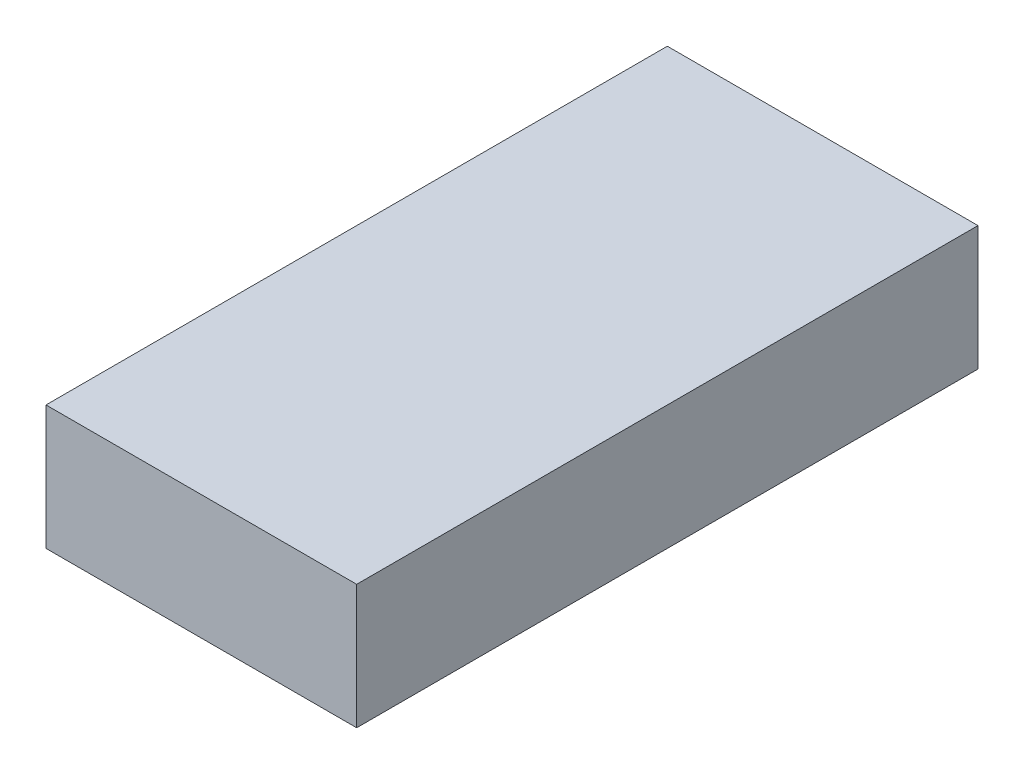
ISO-10303-21;
HEADER;
FILE_DESCRIPTION(('STEP AP214'),'2;1');
FILE_NAME('part.step','',(''),(''),'','','');
FILE_SCHEMA(('AUTOMOTIVE_DESIGN { 1 0 10303 214 1 1 1 1 }'));
ENDSEC;
DATA;
#1=APPLICATION_CONTEXT('core data for automotive mechanical design processes');
#2=APPLICATION_PROTOCOL_DEFINITION('international standard','automotive_design',2000,#1);
#3=PRODUCT_CONTEXT('',#1,'mechanical');
#4=PRODUCT('Part','Part','',(#3));
#5=PRODUCT_RELATED_PRODUCT_CATEGORY('part','',(#4));
#6=PRODUCT_DEFINITION_FORMATION('','',#4);
#7=PRODUCT_DEFINITION_CONTEXT('part definition',#1,'design');
#8=PRODUCT_DEFINITION('design','',#6,#7);
#9=PRODUCT_DEFINITION_SHAPE('','',#8);
#10=(LENGTH_UNIT() NAMED_UNIT(*) SI_UNIT(.MILLI.,.METRE.));
#11=(NAMED_UNIT(*) PLANE_ANGLE_UNIT() SI_UNIT($,.RADIAN.));
#12=(NAMED_UNIT(*) SI_UNIT($,.STERADIAN.) SOLID_ANGLE_UNIT());
#13=UNCERTAINTY_MEASURE_WITH_UNIT(LENGTH_MEASURE(1.E-05),#10,'distance_accuracy_value','');
#14=(GEOMETRIC_REPRESENTATION_CONTEXT(3) GLOBAL_UNCERTAINTY_ASSIGNED_CONTEXT((#13)) GLOBAL_UNIT_ASSIGNED_CONTEXT((#10,
#11,#12)) REPRESENTATION_CONTEXT('',''));
#15=CARTESIAN_POINT('',(0.,0.,0.));
#16=DIRECTION('',(0.,0.,1.));
#17=DIRECTION('',(1.,0.,0.));
#18=AXIS2_PLACEMENT_3D('',#15,#16,#17);
#19=CARTESIAN_POINT('',(0.,0.,100.));
#20=DIRECTION('',(-1.,0.,0.));
#21=DIRECTION('',(0.,0.,1.));
#22=AXIS2_PLACEMENT_3D('',#19,#20,#21);
#23=PLANE('',#22);
#24=DIRECTION('',(0.,1.,0.));
#25=VECTOR('',#24,1.);
#26=CARTESIAN_POINT('',(0.,0.,0.));
#27=LINE('',#26,#25);
#28=CARTESIAN_POINT('',(0.,0.,0.));
#29=VERTEX_POINT('',#28);
#30=CARTESIAN_POINT('',(0.,20.,0.));
#31=VERTEX_POINT('',#30);
#32=EDGE_CURVE('E96',#29,#31,#27,.T.);
#33=ORIENTED_EDGE('',*,*,#32,.T.);
#34=DIRECTION('',(0.,0.,-1.));
#35=VECTOR('',#34,1.);
#36=CARTESIAN_POINT('',(0.,20.,100.));
#37=LINE('',#36,#35);
#38=CARTESIAN_POINT('',(0.,20.,100.));
#39=VERTEX_POINT('',#38);
#40=EDGE_CURVE('E11',#39,#31,#37,.T.);
#41=ORIENTED_EDGE('',*,*,#40,.F.);
#42=DIRECTION('',(0.,1.,0.));
#43=VECTOR('',#42,1.);
#44=CARTESIAN_POINT('',(0.,0.,100.));
#45=LINE('',#44,#43);
#46=CARTESIAN_POINT('',(0.,0.,100.));
#47=VERTEX_POINT('',#46);
#48=EDGE_CURVE('E84',#47,#39,#45,.T.);
#49=ORIENTED_EDGE('',*,*,#48,.F.);
#50=DIRECTION('',(0.,0.,-1.));
#51=VECTOR('',#50,1.);
#52=CARTESIAN_POINT('',(0.,0.,100.));
#53=LINE('',#52,#51);
#54=EDGE_CURVE('E92',#47,#29,#53,.T.);
#55=ORIENTED_EDGE('',*,*,#54,.T.);
#56=EDGE_LOOP('',(#33,#41,#49,#55));
#57=FACE_BOUND('',#56,.T.);
#58=ADVANCED_FACE('F33',(#57),#23,.F.);
#59=CARTESIAN_POINT('',(0.,20.,100.));
#60=DIRECTION('',(0.,-1.,0.));
#61=DIRECTION('',(1.,0.,0.));
#62=AXIS2_PLACEMENT_3D('',#59,#60,#61);
#63=PLANE('',#62);
#64=DIRECTION('',(-1.,0.,0.));
#65=VECTOR('',#64,1.);
#66=CARTESIAN_POINT('',(0.,20.,0.));
#67=LINE('',#66,#65);
#68=CARTESIAN_POINT('',(-50.,20.,0.));
#69=VERTEX_POINT('',#68);
#70=EDGE_CURVE('E88',#31,#69,#67,.T.);
#71=ORIENTED_EDGE('',*,*,#70,.T.);
#72=DIRECTION('',(0.,0.,-1.));
#73=VECTOR('',#72,1.);
#74=CARTESIAN_POINT('',(-50.,20.,100.));
#75=LINE('',#74,#73);
#76=CARTESIAN_POINT('',(-50.,20.,100.));
#77=VERTEX_POINT('',#76);
#78=EDGE_CURVE('E41',#77,#69,#75,.T.);
#79=ORIENTED_EDGE('',*,*,#78,.F.);
#80=DIRECTION('',(-1.,0.,0.));
#81=VECTOR('',#80,1.);
#82=CARTESIAN_POINT('',(0.,20.,100.));
#83=LINE('',#82,#81);
#84=EDGE_CURVE('E79',#39,#77,#83,.T.);
#85=ORIENTED_EDGE('',*,*,#84,.F.);
#86=ORIENTED_EDGE('',*,*,#40,.T.);
#87=EDGE_LOOP('',(#71,#79,#85,#86));
#88=FACE_BOUND('',#87,.T.);
#89=ADVANCED_FACE('F87',(#88),#63,.F.);
#90=CARTESIAN_POINT('',(-50.,0.,100.));
#91=DIRECTION('',(1.,0.,0.));
#92=DIRECTION('',(0.,0.,-1.));
#93=AXIS2_PLACEMENT_3D('',#90,#91,#92);
#94=PLANE('',#93);
#95=DIRECTION('',(0.,-1.,0.));
#96=VECTOR('',#95,1.);
#97=CARTESIAN_POINT('',(-50.,0.,0.));
#98=LINE('',#97,#96);
#99=CARTESIAN_POINT('',(-50.,0.,0.));
#100=VERTEX_POINT('',#99);
#101=EDGE_CURVE('E66',#69,#100,#98,.T.);
#102=ORIENTED_EDGE('',*,*,#101,.T.);
#103=DIRECTION('',(0.,0.,-1.));
#104=VECTOR('',#103,1.);
#105=CARTESIAN_POINT('',(-50.,0.,100.));
#106=LINE('',#105,#104);
#107=CARTESIAN_POINT('',(-50.,0.,100.));
#108=VERTEX_POINT('',#107);
#109=EDGE_CURVE('E89',#108,#100,#106,.T.);
#110=ORIENTED_EDGE('',*,*,#109,.F.);
#111=DIRECTION('',(0.,-1.,0.));
#112=VECTOR('',#111,1.);
#113=CARTESIAN_POINT('',(-50.,0.,100.));
#114=LINE('',#113,#112);
#115=EDGE_CURVE('E82',#77,#108,#114,.T.);
#116=ORIENTED_EDGE('',*,*,#115,.F.);
#117=ORIENTED_EDGE('',*,*,#78,.T.);
#118=EDGE_LOOP('',(#102,#110,#116,#117));
#119=FACE_BOUND('',#118,.T.);
#120=ADVANCED_FACE('F90',(#119),#94,.F.);
#121=CARTESIAN_POINT('',(0.,0.,100.));
#122=DIRECTION('',(0.,1.,0.));
#123=DIRECTION('',(0.,0.,1.));
#124=AXIS2_PLACEMENT_3D('',#121,#122,#123);
#125=PLANE('',#124);
#126=DIRECTION('',(1.,0.,0.));
#127=VECTOR('',#126,1.);
#128=CARTESIAN_POINT('',(0.,0.,0.));
#129=LINE('',#128,#127);
#130=EDGE_CURVE('E72',#100,#29,#129,.T.);
#131=ORIENTED_EDGE('',*,*,#130,.T.);
#132=ORIENTED_EDGE('',*,*,#54,.F.);
#133=DIRECTION('',(1.,0.,0.));
#134=VECTOR('',#133,1.);
#135=CARTESIAN_POINT('',(0.,0.,100.));
#136=LINE('',#135,#134);
#137=EDGE_CURVE('E49',#108,#47,#136,.T.);
#138=ORIENTED_EDGE('',*,*,#137,.F.);
#139=ORIENTED_EDGE('',*,*,#109,.T.);
#140=EDGE_LOOP('',(#131,#132,#138,#139));
#141=FACE_BOUND('',#140,.T.);
#142=ADVANCED_FACE('F103',(#141),#125,.F.);
#143=CARTESIAN_POINT('',(0.,0.,100.));
#144=DIRECTION('',(0.,0.,1.));
#145=DIRECTION('',(1.,0.,0.));
#146=AXIS2_PLACEMENT_3D('',#143,#144,#145);
#147=PLANE('',#146);
#148=ORIENTED_EDGE('',*,*,#48,.T.);
#149=ORIENTED_EDGE('',*,*,#84,.T.);
#150=ORIENTED_EDGE('',*,*,#115,.T.);
#151=ORIENTED_EDGE('',*,*,#137,.T.);
#152=EDGE_LOOP('',(#148,#149,#150,#151));
#153=FACE_BOUND('',#152,.T.);
#154=ADVANCED_FACE('F80',(#153),#147,.T.);
#155=CARTESIAN_POINT('',(0.,0.,0.));
#156=DIRECTION('',(0.,0.,1.));
#157=DIRECTION('',(1.,0.,0.));
#158=AXIS2_PLACEMENT_3D('',#155,#156,#157);
#159=PLANE('',#158);
#160=ORIENTED_EDGE('',*,*,#32,.F.);
#161=ORIENTED_EDGE('',*,*,#130,.F.);
#162=ORIENTED_EDGE('',*,*,#101,.F.);
#163=ORIENTED_EDGE('',*,*,#70,.F.);
#164=EDGE_LOOP('',(#160,#161,#162,#163));
#165=FACE_BOUND('',#164,.T.);
#166=ADVANCED_FACE('F106',(#165),#159,.F.);
#167=CLOSED_SHELL('',(#58,#89,#120,#142,#154,#166));
#168=MANIFOLD_SOLID_BREP('B2',#167);
#169=ADVANCED_BREP_SHAPE_REPRESENTATION('',(#18,#168),#14);
#170=SHAPE_DEFINITION_REPRESENTATION(#9,#169);
ENDSEC;
END-ISO-10303-21;
